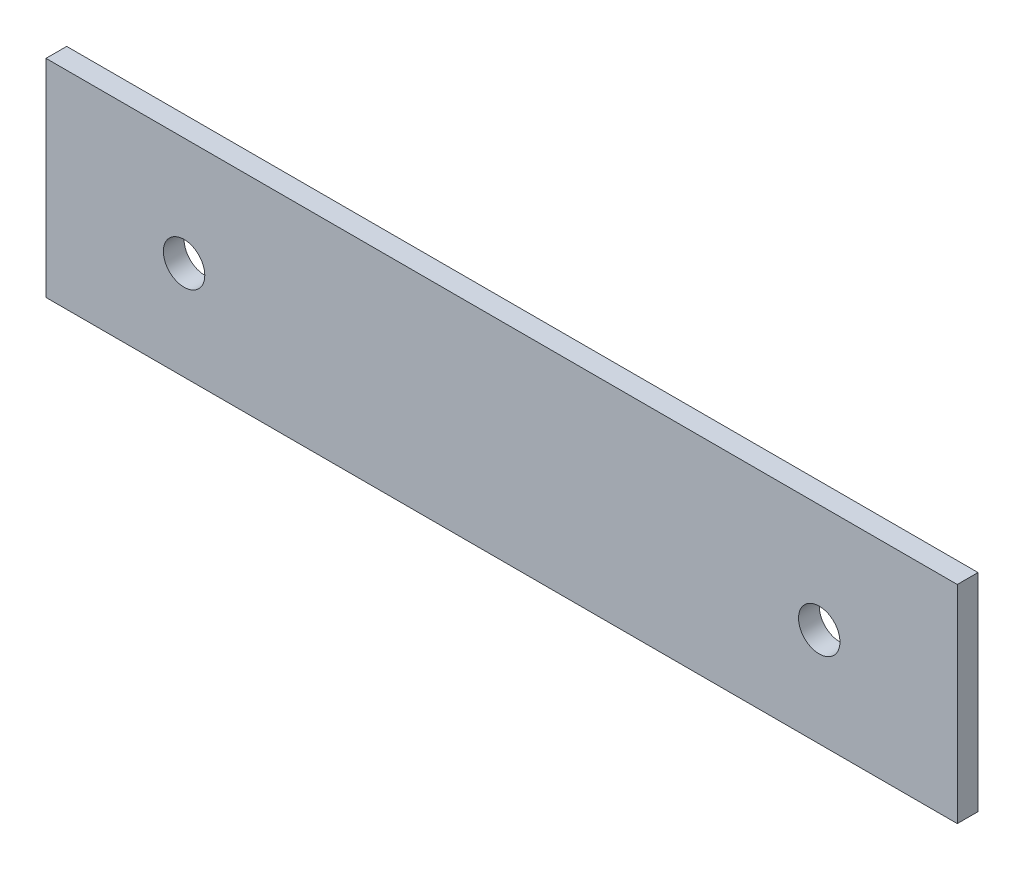
ISO-10303-21;
HEADER;
FILE_DESCRIPTION(('STEP AP214'),'2;1');
FILE_NAME('part.step','',(''),(''),'','','');
FILE_SCHEMA(('AUTOMOTIVE_DESIGN { 1 0 10303 214 1 1 1 1 }'));
ENDSEC;
DATA;
#1=APPLICATION_CONTEXT('core data for automotive mechanical design processes');
#2=APPLICATION_PROTOCOL_DEFINITION('international standard','automotive_design',2000,#1);
#3=PRODUCT_CONTEXT('',#1,'mechanical');
#4=PRODUCT('Part','Part','',(#3));
#5=PRODUCT_RELATED_PRODUCT_CATEGORY('part','',(#4));
#6=PRODUCT_DEFINITION_FORMATION('','',#4);
#7=PRODUCT_DEFINITION_CONTEXT('part definition',#1,'design');
#8=PRODUCT_DEFINITION('design','',#6,#7);
#9=PRODUCT_DEFINITION_SHAPE('','',#8);
#10=(LENGTH_UNIT() NAMED_UNIT(*) SI_UNIT(.MILLI.,.METRE.));
#11=(NAMED_UNIT(*) PLANE_ANGLE_UNIT() SI_UNIT($,.RADIAN.));
#12=(NAMED_UNIT(*) SI_UNIT($,.STERADIAN.) SOLID_ANGLE_UNIT());
#13=UNCERTAINTY_MEASURE_WITH_UNIT(LENGTH_MEASURE(1.E-05),#10,'distance_accuracy_value','');
#14=(GEOMETRIC_REPRESENTATION_CONTEXT(3) GLOBAL_UNCERTAINTY_ASSIGNED_CONTEXT((#13)) GLOBAL_UNIT_ASSIGNED_CONTEXT((#10,
#11,#12)) REPRESENTATION_CONTEXT('',''));
#15=CARTESIAN_POINT('',(0.,0.,0.));
#16=DIRECTION('',(0.,0.,1.));
#17=DIRECTION('',(1.,0.,0.));
#18=AXIS2_PLACEMENT_3D('',#15,#16,#17);
#19=CARTESIAN_POINT('',(-26.6554475439091,4.76227513227513,1.5));
#20=DIRECTION('',(0.,0.,1.));
#21=DIRECTION('',(1.,0.,0.));
#22=AXIS2_PLACEMENT_3D('',#19,#20,#21);
#23=PLANE('',#22);
#24=CARTESIAN_POINT('',(-16.6554475439091,11.904943044836,1.5));
#25=DIRECTION('',(0.,0.,1.));
#26=DIRECTION('',(1.,0.,0.));
#27=AXIS2_PLACEMENT_3D('',#24,#25,#26);
#28=CIRCLE('',#27,1.5);
#29=CARTESIAN_POINT('',(-15.1554475439091,11.904943044836,1.5));
#30=VERTEX_POINT('',#29);
#31=EDGE_CURVE('E98',#30,#30,#28,.T.);
#32=ORIENTED_EDGE('',*,*,#31,.F.);
#33=EDGE_LOOP('',(#32));
#34=FACE_BOUND('',#33,.T.);
#35=DIRECTION('',(0.,-1.,0.));
#36=VECTOR('',#35,1.);
#37=CARTESIAN_POINT('',(-26.6554475439091,19.7622751322751,1.5));
#38=LINE('',#37,#36);
#39=CARTESIAN_POINT('',(-26.6554475439091,19.7622751322751,1.5));
#40=VERTEX_POINT('',#39);
#41=CARTESIAN_POINT('',(-26.6554475439091,4.76227513227513,1.5));
#42=VERTEX_POINT('',#41);
#43=EDGE_CURVE('E83',#40,#42,#38,.T.);
#44=ORIENTED_EDGE('',*,*,#43,.T.);
#45=DIRECTION('',(1.,0.,0.));
#46=VECTOR('',#45,1.);
#47=CARTESIAN_POINT('',(-26.6554475439091,4.76227513227513,1.5));
#48=LINE('',#47,#46);
#49=CARTESIAN_POINT('',(39.3445524560909,4.76227513227513,1.5));
#50=VERTEX_POINT('',#49);
#51=EDGE_CURVE('E78',#42,#50,#48,.T.);
#52=ORIENTED_EDGE('',*,*,#51,.T.);
#53=DIRECTION('',(0.,1.,0.));
#54=VECTOR('',#53,1.);
#55=CARTESIAN_POINT('',(39.3445524560909,19.7622751322751,1.5));
#56=LINE('',#55,#54);
#57=CARTESIAN_POINT('',(39.3445524560909,19.7622751322751,1.5));
#58=VERTEX_POINT('',#57);
#59=EDGE_CURVE('E81',#50,#58,#56,.T.);
#60=ORIENTED_EDGE('',*,*,#59,.T.);
#61=DIRECTION('',(-1.,0.,0.));
#62=VECTOR('',#61,1.);
#63=CARTESIAN_POINT('',(-26.6554475439091,19.7622751322751,1.5));
#64=LINE('',#63,#62);
#65=EDGE_CURVE('E48',#58,#40,#64,.T.);
#66=ORIENTED_EDGE('',*,*,#65,.T.);
#67=EDGE_LOOP('',(#44,#52,#60,#66));
#68=FACE_BOUND('',#67,.T.);
#69=CARTESIAN_POINT('',(29.3445524560909,11.904943044836,1.5));
#70=DIRECTION('',(0.,0.,1.));
#71=DIRECTION('',(1.,0.,0.));
#72=AXIS2_PLACEMENT_3D('',#69,#70,#71);
#73=CIRCLE('',#72,1.5);
#74=CARTESIAN_POINT('',(30.8445524560909,11.904943044836,1.5));
#75=VERTEX_POINT('',#74);
#76=EDGE_CURVE('E113',#75,#75,#73,.T.);
#77=ORIENTED_EDGE('',*,*,#76,.F.);
#78=EDGE_LOOP('',(#77));
#79=FACE_BOUND('',#78,.T.);
#80=ADVANCED_FACE('F31',(#34,#68,#79),#23,.T.);
#81=CARTESIAN_POINT('',(-26.6554475439091,4.76227513227513,0.));
#82=DIRECTION('',(0.,0.,1.));
#83=DIRECTION('',(1.,0.,0.));
#84=AXIS2_PLACEMENT_3D('',#81,#82,#83);
#85=PLANE('',#84);
#86=CARTESIAN_POINT('',(-16.6554475439091,11.904943044836,0.));
#87=DIRECTION('',(0.,0.,1.));
#88=DIRECTION('',(1.,0.,0.));
#89=AXIS2_PLACEMENT_3D('',#86,#87,#88);
#90=CIRCLE('',#89,1.5);
#91=CARTESIAN_POINT('',(-15.1554475439091,11.904943044836,0.));
#92=VERTEX_POINT('',#91);
#93=EDGE_CURVE('E110',#92,#92,#90,.T.);
#94=ORIENTED_EDGE('',*,*,#93,.T.);
#95=EDGE_LOOP('',(#94));
#96=FACE_BOUND('',#95,.T.);
#97=DIRECTION('',(0.,-1.,0.));
#98=VECTOR('',#97,1.);
#99=CARTESIAN_POINT('',(-26.6554475439091,19.7622751322751,0.));
#100=LINE('',#99,#98);
#101=CARTESIAN_POINT('',(-26.6554475439091,19.7622751322751,0.));
#102=VERTEX_POINT('',#101);
#103=CARTESIAN_POINT('',(-26.6554475439091,4.76227513227513,0.));
#104=VERTEX_POINT('',#103);
#105=EDGE_CURVE('E95',#102,#104,#100,.T.);
#106=ORIENTED_EDGE('',*,*,#105,.F.);
#107=DIRECTION('',(-1.,0.,0.));
#108=VECTOR('',#107,1.);
#109=CARTESIAN_POINT('',(-26.6554475439091,19.7622751322751,0.));
#110=LINE('',#109,#108);
#111=CARTESIAN_POINT('',(39.3445524560909,19.7622751322751,0.));
#112=VERTEX_POINT('',#111);
#113=EDGE_CURVE('E71',#112,#102,#110,.T.);
#114=ORIENTED_EDGE('',*,*,#113,.F.);
#115=DIRECTION('',(0.,1.,0.));
#116=VECTOR('',#115,1.);
#117=CARTESIAN_POINT('',(39.3445524560909,19.7622751322751,0.));
#118=LINE('',#117,#116);
#119=CARTESIAN_POINT('',(39.3445524560909,4.76227513227513,0.));
#120=VERTEX_POINT('',#119);
#121=EDGE_CURVE('E65',#120,#112,#118,.T.);
#122=ORIENTED_EDGE('',*,*,#121,.F.);
#123=DIRECTION('',(1.,0.,0.));
#124=VECTOR('',#123,1.);
#125=CARTESIAN_POINT('',(-26.6554475439091,4.76227513227513,0.));
#126=LINE('',#125,#124);
#127=EDGE_CURVE('E87',#104,#120,#126,.T.);
#128=ORIENTED_EDGE('',*,*,#127,.F.);
#129=EDGE_LOOP('',(#106,#114,#122,#128));
#130=FACE_BOUND('',#129,.T.);
#131=CARTESIAN_POINT('',(29.3445524560909,11.904943044836,0.));
#132=DIRECTION('',(0.,0.,1.));
#133=DIRECTION('',(1.,0.,0.));
#134=AXIS2_PLACEMENT_3D('',#131,#132,#133);
#135=CIRCLE('',#134,1.5);
#136=CARTESIAN_POINT('',(30.8445524560909,11.904943044836,0.));
#137=VERTEX_POINT('',#136);
#138=EDGE_CURVE('E116',#137,#137,#135,.T.);
#139=ORIENTED_EDGE('',*,*,#138,.T.);
#140=EDGE_LOOP('',(#139));
#141=FACE_BOUND('',#140,.T.);
#142=ADVANCED_FACE('F106',(#96,#130,#141),#85,.F.);
#143=CARTESIAN_POINT('',(-26.6554475439091,19.7622751322751,1.5));
#144=DIRECTION('',(1.,0.,0.));
#145=DIRECTION('',(0.,1.,0.));
#146=AXIS2_PLACEMENT_3D('',#143,#144,#145);
#147=PLANE('',#146);
#148=ORIENTED_EDGE('',*,*,#105,.T.);
#149=DIRECTION('',(0.,0.,-1.));
#150=VECTOR('',#149,1.);
#151=CARTESIAN_POINT('',(-26.6554475439091,4.76227513227513,1.5));
#152=LINE('',#151,#150);
#153=EDGE_CURVE('E11',#42,#104,#152,.T.);
#154=ORIENTED_EDGE('',*,*,#153,.F.);
#155=ORIENTED_EDGE('',*,*,#43,.F.);
#156=DIRECTION('',(0.,0.,-1.));
#157=VECTOR('',#156,1.);
#158=CARTESIAN_POINT('',(-26.6554475439091,19.7622751322751,1.5));
#159=LINE('',#158,#157);
#160=EDGE_CURVE('E91',#40,#102,#159,.T.);
#161=ORIENTED_EDGE('',*,*,#160,.T.);
#162=EDGE_LOOP('',(#148,#154,#155,#161));
#163=FACE_BOUND('',#162,.T.);
#164=ADVANCED_FACE('F33',(#163),#147,.F.);
#165=CARTESIAN_POINT('',(-26.6554475439091,4.76227513227513,1.5));
#166=DIRECTION('',(0.,1.,0.));
#167=DIRECTION('',(0.,0.,1.));
#168=AXIS2_PLACEMENT_3D('',#165,#166,#167);
#169=PLANE('',#168);
#170=ORIENTED_EDGE('',*,*,#127,.T.);
#171=DIRECTION('',(0.,0.,-1.));
#172=VECTOR('',#171,1.);
#173=CARTESIAN_POINT('',(39.3445524560909,4.76227513227513,1.5));
#174=LINE('',#173,#172);
#175=EDGE_CURVE('E40',#50,#120,#174,.T.);
#176=ORIENTED_EDGE('',*,*,#175,.F.);
#177=ORIENTED_EDGE('',*,*,#51,.F.);
#178=ORIENTED_EDGE('',*,*,#153,.T.);
#179=EDGE_LOOP('',(#170,#176,#177,#178));
#180=FACE_BOUND('',#179,.T.);
#181=ADVANCED_FACE('F86',(#180),#169,.F.);
#182=CARTESIAN_POINT('',(39.3445524560909,19.7622751322751,1.5));
#183=DIRECTION('',(-1.,0.,0.));
#184=DIRECTION('',(0.,-1.,0.));
#185=AXIS2_PLACEMENT_3D('',#182,#183,#184);
#186=PLANE('',#185);
#187=ORIENTED_EDGE('',*,*,#121,.T.);
#188=DIRECTION('',(0.,0.,-1.));
#189=VECTOR('',#188,1.);
#190=CARTESIAN_POINT('',(39.3445524560909,19.7622751322751,1.5));
#191=LINE('',#190,#189);
#192=EDGE_CURVE('E88',#58,#112,#191,.T.);
#193=ORIENTED_EDGE('',*,*,#192,.F.);
#194=ORIENTED_EDGE('',*,*,#59,.F.);
#195=ORIENTED_EDGE('',*,*,#175,.T.);
#196=EDGE_LOOP('',(#187,#193,#194,#195));
#197=FACE_BOUND('',#196,.T.);
#198=ADVANCED_FACE('F89',(#197),#186,.F.);
#199=CARTESIAN_POINT('',(-26.6554475439091,19.7622751322751,1.5));
#200=DIRECTION('',(0.,-1.,0.));
#201=DIRECTION('',(0.,0.,-1.));
#202=AXIS2_PLACEMENT_3D('',#199,#200,#201);
#203=PLANE('',#202);
#204=ORIENTED_EDGE('',*,*,#113,.T.);
#205=ORIENTED_EDGE('',*,*,#160,.F.);
#206=ORIENTED_EDGE('',*,*,#65,.F.);
#207=ORIENTED_EDGE('',*,*,#192,.T.);
#208=EDGE_LOOP('',(#204,#205,#206,#207));
#209=FACE_BOUND('',#208,.T.);
#210=ADVANCED_FACE('F103',(#209),#203,.F.);
#211=CARTESIAN_POINT('',(-16.6554475439091,11.904943044836,1.5));
#212=DIRECTION('',(0.,0.,-1.));
#213=DIRECTION('',(-1.,0.,0.));
#214=AXIS2_PLACEMENT_3D('',#211,#212,#213);
#215=CYLINDRICAL_SURFACE('',#214,1.5);
#216=ORIENTED_EDGE('',*,*,#31,.T.);
#217=EDGE_LOOP('',(#216));
#218=FACE_BOUND('',#217,.T.);
#219=ORIENTED_EDGE('',*,*,#93,.F.);
#220=EDGE_LOOP('',(#219));
#221=FACE_BOUND('',#220,.T.);
#222=ADVANCED_FACE('F134',(#218,#221),#215,.F.);
#223=CARTESIAN_POINT('',(29.3445524560909,11.904943044836,1.5));
#224=DIRECTION('',(0.,0.,-1.));
#225=DIRECTION('',(-1.,0.,0.));
#226=AXIS2_PLACEMENT_3D('',#223,#224,#225);
#227=CYLINDRICAL_SURFACE('',#226,1.5);
#228=ORIENTED_EDGE('',*,*,#76,.T.);
#229=EDGE_LOOP('',(#228));
#230=FACE_BOUND('',#229,.T.);
#231=ORIENTED_EDGE('',*,*,#138,.F.);
#232=EDGE_LOOP('',(#231));
#233=FACE_BOUND('',#232,.T.);
#234=ADVANCED_FACE('F122',(#230,#233),#227,.F.);
#235=CLOSED_SHELL('',(#80,#142,#164,#181,#198,#210,#222,#234));
#236=MANIFOLD_SOLID_BREP('B2',#235);
#237=ADVANCED_BREP_SHAPE_REPRESENTATION('',(#18,#236),#14);
#238=SHAPE_DEFINITION_REPRESENTATION(#9,#237);
ENDSEC;
END-ISO-10303-21;
